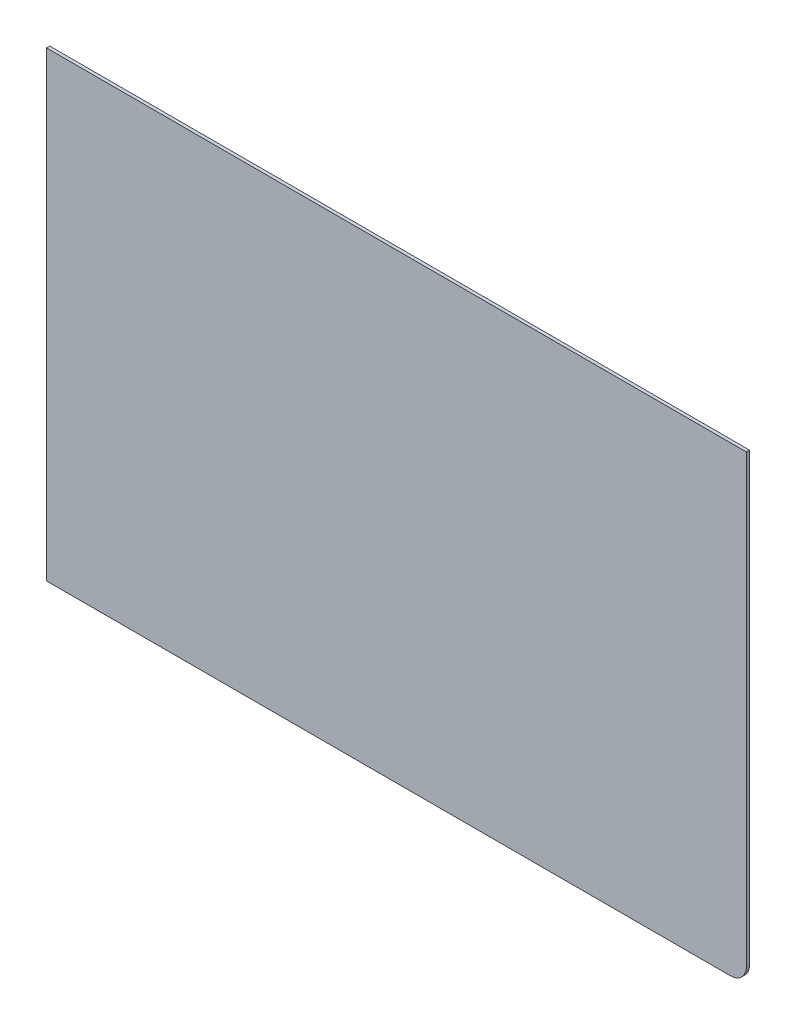
ISO-10303-21;
HEADER;
FILE_DESCRIPTION(('STEP AP214'),'2;1');
FILE_NAME('part.step','',(''),(''),'','','');
FILE_SCHEMA(('AUTOMOTIVE_DESIGN { 1 0 10303 214 1 1 1 1 }'));
ENDSEC;
DATA;
#1=APPLICATION_CONTEXT('core data for automotive mechanical design processes');
#2=APPLICATION_PROTOCOL_DEFINITION('international standard','automotive_design',2000,#1);
#3=PRODUCT_CONTEXT('',#1,'mechanical');
#4=PRODUCT('Part','Part','',(#3));
#5=PRODUCT_RELATED_PRODUCT_CATEGORY('part','',(#4));
#6=PRODUCT_DEFINITION_FORMATION('','',#4);
#7=PRODUCT_DEFINITION_CONTEXT('part definition',#1,'design');
#8=PRODUCT_DEFINITION('design','',#6,#7);
#9=PRODUCT_DEFINITION_SHAPE('','',#8);
#10=(LENGTH_UNIT() NAMED_UNIT(*) SI_UNIT(.MILLI.,.METRE.));
#11=(NAMED_UNIT(*) PLANE_ANGLE_UNIT() SI_UNIT($,.RADIAN.));
#12=(NAMED_UNIT(*) SI_UNIT($,.STERADIAN.) SOLID_ANGLE_UNIT());
#13=UNCERTAINTY_MEASURE_WITH_UNIT(LENGTH_MEASURE(1.E-05),#10,'distance_accuracy_value','');
#14=(GEOMETRIC_REPRESENTATION_CONTEXT(3) GLOBAL_UNCERTAINTY_ASSIGNED_CONTEXT((#13)) GLOBAL_UNIT_ASSIGNED_CONTEXT((#10,
#11,#12)) REPRESENTATION_CONTEXT('',''));
#15=CARTESIAN_POINT('',(0.,0.,0.));
#16=DIRECTION('',(0.,0.,1.));
#17=DIRECTION('',(1.,0.,0.));
#18=AXIS2_PLACEMENT_3D('',#15,#16,#17);
#19=CARTESIAN_POINT('',(219.8,-7.49999999999993,1.));
#20=DIRECTION('',(-1.,0.,0.));
#21=DIRECTION('',(0.,-1.,0.));
#22=AXIS2_PLACEMENT_3D('',#19,#20,#21);
#23=PLANE('',#22);
#24=DIRECTION('',(0.,1.,0.));
#25=VECTOR('',#24,1.);
#26=CARTESIAN_POINT('',(219.8,-7.49999999999993,1.));
#27=LINE('',#26,#25);
#28=CARTESIAN_POINT('',(219.8,-147.4732,1.));
#29=VERTEX_POINT('',#28);
#30=CARTESIAN_POINT('',(219.8,-7.49999999999993,1.));
#31=VERTEX_POINT('',#30);
#32=EDGE_CURVE('E81',#29,#31,#27,.T.);
#33=ORIENTED_EDGE('',*,*,#32,.F.);
#34=DIRECTION('',(0.,0.,-1.));
#35=VECTOR('',#34,1.);
#36=CARTESIAN_POINT('',(219.8,-147.4732,1.));
#37=LINE('',#36,#35);
#38=CARTESIAN_POINT('',(219.8,-147.4732,0.));
#39=VERTEX_POINT('',#38);
#40=EDGE_CURVE('E104',#29,#39,#37,.T.);
#41=ORIENTED_EDGE('',*,*,#40,.T.);
#42=DIRECTION('',(0.,1.,0.));
#43=VECTOR('',#42,1.);
#44=CARTESIAN_POINT('',(219.8,-7.49999999999993,0.));
#45=LINE('',#44,#43);
#46=CARTESIAN_POINT('',(219.8,-7.49999999999993,0.));
#47=VERTEX_POINT('',#46);
#48=EDGE_CURVE('E102',#39,#47,#45,.T.);
#49=ORIENTED_EDGE('',*,*,#48,.T.);
#50=DIRECTION('',(0.,0.,-1.));
#51=VECTOR('',#50,1.);
#52=CARTESIAN_POINT('',(219.8,-7.49999999999993,1.));
#53=LINE('',#52,#51);
#54=EDGE_CURVE('E96',#31,#47,#53,.T.);
#55=ORIENTED_EDGE('',*,*,#54,.F.);
#56=EDGE_LOOP('',(#33,#41,#49,#55));
#57=FACE_BOUND('',#56,.T.);
#58=ADVANCED_FACE('F35',(#57),#23,.F.);
#59=CARTESIAN_POINT('',(219.8,-7.49999999999993,1.));
#60=DIRECTION('',(0.,-1.,0.));
#61=DIRECTION('',(1.,0.,0.));
#62=AXIS2_PLACEMENT_3D('',#59,#60,#61);
#63=PLANE('',#62);
#64=DIRECTION('',(-1.,0.,0.));
#65=VECTOR('',#64,1.);
#66=CARTESIAN_POINT('',(219.8,-7.49999999999993,0.));
#67=LINE('',#66,#65);
#68=CARTESIAN_POINT('',(1.38777878078145E-13,-7.49999999999995,0.));
#69=VERTEX_POINT('',#68);
#70=EDGE_CURVE('E117',#47,#69,#67,.T.);
#71=ORIENTED_EDGE('',*,*,#70,.T.);
#72=DIRECTION('',(0.,0.,-1.));
#73=VECTOR('',#72,1.);
#74=CARTESIAN_POINT('',(1.38777878078145E-13,-7.49999999999995,1.));
#75=LINE('',#74,#73);
#76=CARTESIAN_POINT('',(1.38777878078145E-13,-7.49999999999995,1.));
#77=VERTEX_POINT('',#76);
#78=EDGE_CURVE('E98',#77,#69,#75,.T.);
#79=ORIENTED_EDGE('',*,*,#78,.F.);
#80=DIRECTION('',(-1.,0.,0.));
#81=VECTOR('',#80,1.);
#82=CARTESIAN_POINT('',(219.8,-7.49999999999993,1.));
#83=LINE('',#82,#81);
#84=EDGE_CURVE('E84',#31,#77,#83,.T.);
#85=ORIENTED_EDGE('',*,*,#84,.F.);
#86=ORIENTED_EDGE('',*,*,#54,.T.);
#87=EDGE_LOOP('',(#71,#79,#85,#86));
#88=FACE_BOUND('',#87,.T.);
#89=ADVANCED_FACE('F95',(#88),#63,.F.);
#90=CARTESIAN_POINT('',(1.38777878078145E-13,-7.49999999999995,1.));
#91=DIRECTION('',(1.,0.,0.));
#92=DIRECTION('',(0.,1.,0.));
#93=AXIS2_PLACEMENT_3D('',#90,#91,#92);
#94=PLANE('',#93);
#95=DIRECTION('',(0.,-1.,0.));
#96=VECTOR('',#95,1.);
#97=CARTESIAN_POINT('',(1.38777878078145E-13,-7.49999999999995,0.));
#98=LINE('',#97,#96);
#99=CARTESIAN_POINT('',(1.44997069386487E-13,-152.4732,0.));
#100=VERTEX_POINT('',#99);
#101=EDGE_CURVE('E115',#69,#100,#98,.T.);
#102=ORIENTED_EDGE('',*,*,#101,.T.);
#103=DIRECTION('',(0.,0.,-1.));
#104=VECTOR('',#103,1.);
#105=CARTESIAN_POINT('',(1.44997069386487E-13,-152.4732,1.));
#106=LINE('',#105,#104);
#107=CARTESIAN_POINT('',(1.44997069386487E-13,-152.4732,1.));
#108=VERTEX_POINT('',#107);
#109=EDGE_CURVE('E107',#108,#100,#106,.T.);
#110=ORIENTED_EDGE('',*,*,#109,.F.);
#111=DIRECTION('',(0.,-1.,0.));
#112=VECTOR('',#111,1.);
#113=CARTESIAN_POINT('',(1.38777878078145E-13,-7.49999999999995,1.));
#114=LINE('',#113,#112);
#115=EDGE_CURVE('E100',#77,#108,#114,.T.);
#116=ORIENTED_EDGE('',*,*,#115,.F.);
#117=ORIENTED_EDGE('',*,*,#78,.T.);
#118=EDGE_LOOP('',(#102,#110,#116,#117));
#119=FACE_BOUND('',#118,.T.);
#120=ADVANCED_FACE('F123',(#119),#94,.F.);
#121=CARTESIAN_POINT('',(219.8,-152.4732,1.));
#122=DIRECTION('',(0.,1.,0.));
#123=DIRECTION('',(-1.,0.,0.));
#124=AXIS2_PLACEMENT_3D('',#121,#122,#123);
#125=PLANE('',#124);
#126=DIRECTION('',(1.,0.,0.));
#127=VECTOR('',#126,1.);
#128=CARTESIAN_POINT('',(219.8,-152.4732,0.));
#129=LINE('',#128,#127);
#130=CARTESIAN_POINT('',(214.8,-152.4732,0.));
#131=VERTEX_POINT('',#130);
#132=EDGE_CURVE('E91',#100,#131,#129,.T.);
#133=ORIENTED_EDGE('',*,*,#132,.T.);
#134=DIRECTION('',(0.,0.,-1.));
#135=VECTOR('',#134,1.);
#136=CARTESIAN_POINT('',(214.8,-152.4732,1.));
#137=LINE('',#136,#135);
#138=CARTESIAN_POINT('',(214.8,-152.4732,1.));
#139=VERTEX_POINT('',#138);
#140=EDGE_CURVE('E43',#131,#139,#137,.F.);
#141=ORIENTED_EDGE('',*,*,#140,.T.);
#142=DIRECTION('',(1.,0.,0.));
#143=VECTOR('',#142,1.);
#144=CARTESIAN_POINT('',(219.8,-152.4732,1.));
#145=LINE('',#144,#143);
#146=EDGE_CURVE('E113',#108,#139,#145,.T.);
#147=ORIENTED_EDGE('',*,*,#146,.F.);
#148=ORIENTED_EDGE('',*,*,#109,.T.);
#149=EDGE_LOOP('',(#133,#141,#147,#148));
#150=FACE_BOUND('',#149,.T.);
#151=ADVANCED_FACE('F125',(#150),#125,.F.);
#152=CARTESIAN_POINT('',(0.,0.,1.));
#153=DIRECTION('',(0.,0.,-1.));
#154=DIRECTION('',(-1.,0.,0.));
#155=AXIS2_PLACEMENT_3D('',#152,#153,#154);
#156=PLANE('',#155);
#157=ORIENTED_EDGE('',*,*,#146,.T.);
#158=CARTESIAN_POINT('',(214.8,-147.4732,1.));
#159=DIRECTION('',(0.,0.,-1.));
#160=DIRECTION('',(-1.,0.,0.));
#161=AXIS2_PLACEMENT_3D('',#158,#159,#160);
#162=CIRCLE('',#161,5.);
#163=EDGE_CURVE('E11',#139,#29,#162,.F.);
#164=ORIENTED_EDGE('',*,*,#163,.T.);
#165=ORIENTED_EDGE('',*,*,#32,.T.);
#166=ORIENTED_EDGE('',*,*,#84,.T.);
#167=ORIENTED_EDGE('',*,*,#115,.T.);
#168=EDGE_LOOP('',(#157,#164,#165,#166,#167));
#169=FACE_BOUND('',#168,.T.);
#170=ADVANCED_FACE('F83',(#169),#156,.F.);
#171=CARTESIAN_POINT('',(0.,0.,0.));
#172=DIRECTION('',(0.,0.,-1.));
#173=DIRECTION('',(-1.,0.,0.));
#174=AXIS2_PLACEMENT_3D('',#171,#172,#173);
#175=PLANE('',#174);
#176=ORIENTED_EDGE('',*,*,#48,.F.);
#177=CARTESIAN_POINT('',(214.8,-147.4732,0.));
#178=DIRECTION('',(0.,0.,-1.));
#179=DIRECTION('',(-1.,0.,0.));
#180=AXIS2_PLACEMENT_3D('',#177,#178,#179);
#181=CIRCLE('',#180,5.);
#182=EDGE_CURVE('E57',#39,#131,#181,.T.);
#183=ORIENTED_EDGE('',*,*,#182,.T.);
#184=ORIENTED_EDGE('',*,*,#132,.F.);
#185=ORIENTED_EDGE('',*,*,#101,.F.);
#186=ORIENTED_EDGE('',*,*,#70,.F.);
#187=EDGE_LOOP('',(#176,#183,#184,#185,#186));
#188=FACE_BOUND('',#187,.T.);
#189=ADVANCED_FACE('F132',(#188),#175,.T.);
#190=CARTESIAN_POINT('',(214.8,-147.4732,1.));
#191=DIRECTION('',(0.,0.,-1.));
#192=DIRECTION('',(-1.,0.,0.));
#193=AXIS2_PLACEMENT_3D('',#190,#191,#192);
#194=CYLINDRICAL_SURFACE('',#193,5.);
#195=ORIENTED_EDGE('',*,*,#163,.F.);
#196=ORIENTED_EDGE('',*,*,#140,.F.);
#197=ORIENTED_EDGE('',*,*,#182,.F.);
#198=ORIENTED_EDGE('',*,*,#40,.F.);
#199=EDGE_LOOP('',(#195,#196,#197,#198));
#200=FACE_BOUND('',#199,.T.);
#201=ADVANCED_FACE('F37',(#200),#194,.T.);
#202=CLOSED_SHELL('',(#58,#89,#120,#151,#170,#189,#201));
#203=MANIFOLD_SOLID_BREP('B2',#202);
#204=ADVANCED_BREP_SHAPE_REPRESENTATION('',(#18,#203),#14);
#205=SHAPE_DEFINITION_REPRESENTATION(#9,#204);
ENDSEC;
END-ISO-10303-21;
